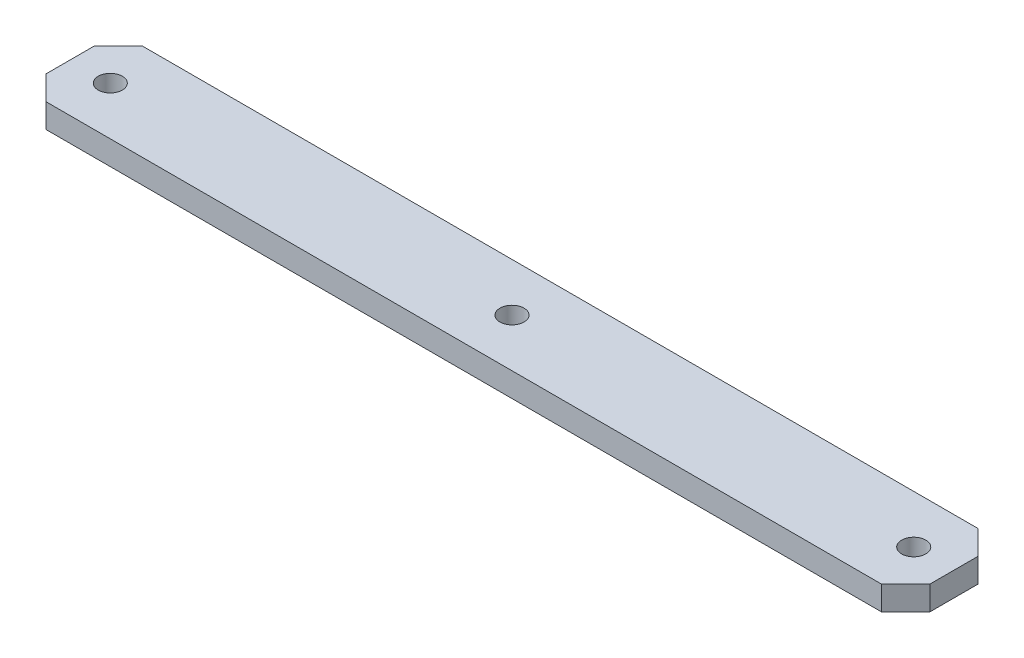
ISO-10303-21;
HEADER;
FILE_DESCRIPTION(('STEP AP214'),'2;1');
FILE_NAME('part.step','',(''),(''),'','','');
FILE_SCHEMA(('AUTOMOTIVE_DESIGN { 1 0 10303 214 1 1 1 1 }'));
ENDSEC;
DATA;
#1=APPLICATION_CONTEXT('core data for automotive mechanical design processes');
#2=APPLICATION_PROTOCOL_DEFINITION('international standard','automotive_design',2000,#1);
#3=PRODUCT_CONTEXT('',#1,'mechanical');
#4=PRODUCT('Part','Part','',(#3));
#5=PRODUCT_RELATED_PRODUCT_CATEGORY('part','',(#4));
#6=PRODUCT_DEFINITION_FORMATION('','',#4);
#7=PRODUCT_DEFINITION_CONTEXT('part definition',#1,'design');
#8=PRODUCT_DEFINITION('design','',#6,#7);
#9=PRODUCT_DEFINITION_SHAPE('','',#8);
#10=(LENGTH_UNIT() NAMED_UNIT(*) SI_UNIT(.MILLI.,.METRE.));
#11=(NAMED_UNIT(*) PLANE_ANGLE_UNIT() SI_UNIT($,.RADIAN.));
#12=(NAMED_UNIT(*) SI_UNIT($,.STERADIAN.) SOLID_ANGLE_UNIT());
#13=UNCERTAINTY_MEASURE_WITH_UNIT(LENGTH_MEASURE(1.E-05),#10,'distance_accuracy_value','');
#14=(GEOMETRIC_REPRESENTATION_CONTEXT(3) GLOBAL_UNCERTAINTY_ASSIGNED_CONTEXT((#13)) GLOBAL_UNIT_ASSIGNED_CONTEXT((#10,
#11,#12)) REPRESENTATION_CONTEXT('',''));
#15=CARTESIAN_POINT('',(0.,0.,0.));
#16=DIRECTION('',(0.,0.,1.));
#17=DIRECTION('',(1.,0.,0.));
#18=AXIS2_PLACEMENT_3D('',#15,#16,#17);
#19=CARTESIAN_POINT('',(0.,3.,0.));
#20=DIRECTION('',(0.,-1.,0.));
#21=DIRECTION('',(0.,0.,-1.));
#22=AXIS2_PLACEMENT_3D('',#19,#20,#21);
#23=PLANE('',#22);
#24=DIRECTION('',(1.,0.,0.));
#25=VECTOR('',#24,1.);
#26=CARTESIAN_POINT('',(-52.,3.,-6.));
#27=LINE('',#26,#25);
#28=CARTESIAN_POINT('',(-52.,3.,-6.));
#29=VERTEX_POINT('',#28);
#30=CARTESIAN_POINT('',(52.,3.,-6.));
#31=VERTEX_POINT('',#30);
#32=EDGE_CURVE('E237',#29,#31,#27,.T.);
#33=ORIENTED_EDGE('',*,*,#32,.F.);
#34=DIRECTION('',(0.707106781186548,0.,-0.707106781186547));
#35=VECTOR('',#34,1.);
#36=CARTESIAN_POINT('',(-55.,3.,-3.));
#37=LINE('',#36,#35);
#38=CARTESIAN_POINT('',(-55.,3.,-3.));
#39=VERTEX_POINT('',#38);
#40=EDGE_CURVE('E197',#39,#29,#37,.T.);
#41=ORIENTED_EDGE('',*,*,#40,.F.);
#42=DIRECTION('',(0.,0.,1.));
#43=VECTOR('',#42,1.);
#44=CARTESIAN_POINT('',(-55.,3.,-3.));
#45=LINE('',#44,#43);
#46=CARTESIAN_POINT('',(-55.,3.,3.));
#47=VERTEX_POINT('',#46);
#48=EDGE_CURVE('E191',#39,#47,#45,.T.);
#49=ORIENTED_EDGE('',*,*,#48,.T.);
#50=DIRECTION('',(0.707106781186548,0.,0.707106781186547));
#51=VECTOR('',#50,1.);
#52=CARTESIAN_POINT('',(-55.,3.,3.));
#53=LINE('',#52,#51);
#54=CARTESIAN_POINT('',(-52.,3.,6.));
#55=VERTEX_POINT('',#54);
#56=EDGE_CURVE('E195',#47,#55,#53,.T.);
#57=ORIENTED_EDGE('',*,*,#56,.T.);
#58=DIRECTION('',(1.,0.,0.));
#59=VECTOR('',#58,1.);
#60=CARTESIAN_POINT('',(-52.,3.,6.));
#61=LINE('',#60,#59);
#62=CARTESIAN_POINT('',(52.,3.,6.));
#63=VERTEX_POINT('',#62);
#64=EDGE_CURVE('E210',#55,#63,#61,.T.);
#65=ORIENTED_EDGE('',*,*,#64,.T.);
#66=DIRECTION('',(0.707106781186549,0.,-0.707106781186546));
#67=VECTOR('',#66,1.);
#68=CARTESIAN_POINT('',(52.,3.,6.));
#69=LINE('',#68,#67);
#70=CARTESIAN_POINT('',(55.,3.,3.));
#71=VERTEX_POINT('',#70);
#72=EDGE_CURVE('E212',#63,#71,#69,.T.);
#73=ORIENTED_EDGE('',*,*,#72,.T.);
#74=DIRECTION('',(0.,0.,1.));
#75=VECTOR('',#74,1.);
#76=CARTESIAN_POINT('',(55.,3.,-3.));
#77=LINE('',#76,#75);
#78=CARTESIAN_POINT('',(55.,3.,-3.));
#79=VERTEX_POINT('',#78);
#80=EDGE_CURVE('E305',#79,#71,#77,.T.);
#81=ORIENTED_EDGE('',*,*,#80,.F.);
#82=DIRECTION('',(0.707106781186549,0.,0.707106781186546));
#83=VECTOR('',#82,1.);
#84=CARTESIAN_POINT('',(52.,3.,-6.));
#85=LINE('',#84,#83);
#86=EDGE_CURVE('E303',#31,#79,#85,.T.);
#87=ORIENTED_EDGE('',*,*,#86,.F.);
#88=EDGE_LOOP('',(#33,#41,#49,#57,#65,#73,#81,#87));
#89=FACE_BOUND('',#88,.T.);
#90=CARTESIAN_POINT('',(-50.,3.,0.));
#91=DIRECTION('',(0.,1.,0.));
#92=DIRECTION('',(0.,0.,1.));
#93=AXIS2_PLACEMENT_3D('',#90,#91,#92);
#94=CIRCLE('',#93,1.5);
#95=CARTESIAN_POINT('',(-50.,3.,1.5));
#96=VERTEX_POINT('',#95);
#97=EDGE_CURVE('E221',#96,#96,#94,.T.);
#98=ORIENTED_EDGE('',*,*,#97,.F.);
#99=EDGE_LOOP('',(#98));
#100=FACE_BOUND('',#99,.T.);
#101=CARTESIAN_POINT('',(0.,3.,0.));
#102=DIRECTION('',(0.,1.,0.));
#103=DIRECTION('',(0.,0.,1.));
#104=AXIS2_PLACEMENT_3D('',#101,#102,#103);
#105=CIRCLE('',#104,1.5);
#106=CARTESIAN_POINT('',(0.,3.,1.5));
#107=VERTEX_POINT('',#106);
#108=EDGE_CURVE('E292',#107,#107,#105,.T.);
#109=ORIENTED_EDGE('',*,*,#108,.F.);
#110=EDGE_LOOP('',(#109));
#111=FACE_BOUND('',#110,.T.);
#112=CARTESIAN_POINT('',(50.,3.,0.));
#113=DIRECTION('',(0.,1.,0.));
#114=DIRECTION('',(0.,0.,1.));
#115=AXIS2_PLACEMENT_3D('',#112,#113,#114);
#116=CIRCLE('',#115,1.5);
#117=CARTESIAN_POINT('',(50.,3.,1.5));
#118=VERTEX_POINT('',#117);
#119=EDGE_CURVE('E283',#118,#118,#116,.T.);
#120=ORIENTED_EDGE('',*,*,#119,.F.);
#121=EDGE_LOOP('',(#120));
#122=FACE_BOUND('',#121,.T.);
#123=ADVANCED_FACE('F120',(#89,#100,#111,#122),#23,.F.);
#124=CARTESIAN_POINT('',(0.,0.,0.));
#125=DIRECTION('',(0.,-1.,0.));
#126=DIRECTION('',(0.,0.,-1.));
#127=AXIS2_PLACEMENT_3D('',#124,#125,#126);
#128=PLANE('',#127);
#129=CARTESIAN_POINT('',(0.,0.,0.));
#130=DIRECTION('',(0.,1.,0.));
#131=DIRECTION('',(0.,0.,1.));
#132=AXIS2_PLACEMENT_3D('',#129,#130,#131);
#133=CIRCLE('',#132,1.5);
#134=CARTESIAN_POINT('',(0.,0.,1.5));
#135=VERTEX_POINT('',#134);
#136=EDGE_CURVE('E289',#135,#135,#133,.T.);
#137=ORIENTED_EDGE('',*,*,#136,.T.);
#138=EDGE_LOOP('',(#137));
#139=FACE_BOUND('',#138,.T.);
#140=DIRECTION('',(1.,0.,0.));
#141=VECTOR('',#140,1.);
#142=CARTESIAN_POINT('',(-52.,0.,-6.));
#143=LINE('',#142,#141);
#144=CARTESIAN_POINT('',(-52.,0.,-6.));
#145=VERTEX_POINT('',#144);
#146=CARTESIAN_POINT('',(52.,0.,-6.));
#147=VERTEX_POINT('',#146);
#148=EDGE_CURVE('E217',#145,#147,#143,.T.);
#149=ORIENTED_EDGE('',*,*,#148,.T.);
#150=DIRECTION('',(0.707106781186549,0.,0.707106781186546));
#151=VECTOR('',#150,1.);
#152=CARTESIAN_POINT('',(52.,0.,-6.));
#153=LINE('',#152,#151);
#154=CARTESIAN_POINT('',(55.,0.,-3.));
#155=VERTEX_POINT('',#154);
#156=EDGE_CURVE('E220',#147,#155,#153,.T.);
#157=ORIENTED_EDGE('',*,*,#156,.T.);
#158=DIRECTION('',(0.,0.,1.));
#159=VECTOR('',#158,1.);
#160=CARTESIAN_POINT('',(55.,0.,-3.));
#161=LINE('',#160,#159);
#162=CARTESIAN_POINT('',(55.,0.,3.));
#163=VERTEX_POINT('',#162);
#164=EDGE_CURVE('E224',#155,#163,#161,.T.);
#165=ORIENTED_EDGE('',*,*,#164,.T.);
#166=DIRECTION('',(0.707106781186549,0.,-0.707106781186546));
#167=VECTOR('',#166,1.);
#168=CARTESIAN_POINT('',(52.,0.,6.));
#169=LINE('',#168,#167);
#170=CARTESIAN_POINT('',(52.,0.,6.));
#171=VERTEX_POINT('',#170);
#172=EDGE_CURVE('E227',#171,#163,#169,.T.);
#173=ORIENTED_EDGE('',*,*,#172,.F.);
#174=DIRECTION('',(1.,0.,0.));
#175=VECTOR('',#174,1.);
#176=CARTESIAN_POINT('',(-52.,0.,6.));
#177=LINE('',#176,#175);
#178=CARTESIAN_POINT('',(-52.,0.,6.));
#179=VERTEX_POINT('',#178);
#180=EDGE_CURVE('E230',#179,#171,#177,.T.);
#181=ORIENTED_EDGE('',*,*,#180,.F.);
#182=DIRECTION('',(0.707106781186548,0.,0.707106781186547));
#183=VECTOR('',#182,1.);
#184=CARTESIAN_POINT('',(-55.,0.,3.));
#185=LINE('',#184,#183);
#186=CARTESIAN_POINT('',(-55.,0.,3.));
#187=VERTEX_POINT('',#186);
#188=EDGE_CURVE('E232',#187,#179,#185,.T.);
#189=ORIENTED_EDGE('',*,*,#188,.F.);
#190=DIRECTION('',(0.,0.,1.));
#191=VECTOR('',#190,1.);
#192=CARTESIAN_POINT('',(-55.,0.,-3.));
#193=LINE('',#192,#191);
#194=CARTESIAN_POINT('',(-55.,0.,-3.));
#195=VERTEX_POINT('',#194);
#196=EDGE_CURVE('E202',#195,#187,#193,.T.);
#197=ORIENTED_EDGE('',*,*,#196,.F.);
#198=DIRECTION('',(0.707106781186548,0.,-0.707106781186547));
#199=VECTOR('',#198,1.);
#200=CARTESIAN_POINT('',(-55.,0.,-3.));
#201=LINE('',#200,#199);
#202=EDGE_CURVE('E235',#195,#145,#201,.T.);
#203=ORIENTED_EDGE('',*,*,#202,.T.);
#204=EDGE_LOOP('',(#149,#157,#165,#173,#181,#189,#197,#203));
#205=FACE_BOUND('',#204,.T.);
#206=CARTESIAN_POINT('',(-50.,0.,0.));
#207=DIRECTION('',(0.,1.,0.));
#208=DIRECTION('',(0.,0.,1.));
#209=AXIS2_PLACEMENT_3D('',#206,#207,#208);
#210=CIRCLE('',#209,1.5);
#211=CARTESIAN_POINT('',(-50.,0.,1.5));
#212=VERTEX_POINT('',#211);
#213=EDGE_CURVE('E295',#212,#212,#210,.T.);
#214=ORIENTED_EDGE('',*,*,#213,.T.);
#215=EDGE_LOOP('',(#214));
#216=FACE_BOUND('',#215,.T.);
#217=CARTESIAN_POINT('',(50.,0.,0.));
#218=DIRECTION('',(0.,1.,0.));
#219=DIRECTION('',(0.,0.,1.));
#220=AXIS2_PLACEMENT_3D('',#217,#218,#219);
#221=CIRCLE('',#220,1.5);
#222=CARTESIAN_POINT('',(50.,0.,1.5));
#223=VERTEX_POINT('',#222);
#224=EDGE_CURVE('E286',#223,#223,#221,.T.);
#225=ORIENTED_EDGE('',*,*,#224,.T.);
#226=EDGE_LOOP('',(#225));
#227=FACE_BOUND('',#226,.T.);
#228=ADVANCED_FACE('F249',(#139,#205,#216,#227),#128,.T.);
#229=CARTESIAN_POINT('',(-52.,3.,-6.));
#230=DIRECTION('',(0.,0.,-1.));
#231=DIRECTION('',(-1.,0.,0.));
#232=AXIS2_PLACEMENT_3D('',#229,#230,#231);
#233=PLANE('',#232);
#234=ORIENTED_EDGE('',*,*,#148,.F.);
#235=DIRECTION('',(0.,-1.,0.));
#236=VECTOR('',#235,1.);
#237=CARTESIAN_POINT('',(-52.,3.,-6.));
#238=LINE('',#237,#236);
#239=EDGE_CURVE('E12',#29,#145,#238,.T.);
#240=ORIENTED_EDGE('',*,*,#239,.F.);
#241=ORIENTED_EDGE('',*,*,#32,.T.);
#242=DIRECTION('',(0.,-1.,0.));
#243=VECTOR('',#242,1.);
#244=CARTESIAN_POINT('',(52.,3.,-6.));
#245=LINE('',#244,#243);
#246=EDGE_CURVE('E124',#31,#147,#245,.T.);
#247=ORIENTED_EDGE('',*,*,#246,.T.);
#248=EDGE_LOOP('',(#234,#240,#241,#247));
#249=FACE_BOUND('',#248,.T.);
#250=ADVANCED_FACE('F122',(#249),#233,.T.);
#251=CARTESIAN_POINT('',(-55.,3.,-3.));
#252=DIRECTION('',(-0.707106781186547,0.,-0.707106781186548));
#253=DIRECTION('',(-0.707106781186548,0.,0.707106781186547));
#254=AXIS2_PLACEMENT_3D('',#251,#252,#253);
#255=PLANE('',#254);
#256=ORIENTED_EDGE('',*,*,#202,.F.);
#257=DIRECTION('',(0.,-1.,0.));
#258=VECTOR('',#257,1.);
#259=CARTESIAN_POINT('',(-55.,3.,-3.));
#260=LINE('',#259,#258);
#261=EDGE_CURVE('E130',#39,#195,#260,.T.);
#262=ORIENTED_EDGE('',*,*,#261,.F.);
#263=ORIENTED_EDGE('',*,*,#40,.T.);
#264=ORIENTED_EDGE('',*,*,#239,.T.);
#265=EDGE_LOOP('',(#256,#262,#263,#264));
#266=FACE_BOUND('',#265,.T.);
#267=ADVANCED_FACE('F251',(#266),#255,.T.);
#268=CARTESIAN_POINT('',(-55.,3.,-3.));
#269=DIRECTION('',(1.,0.,0.));
#270=DIRECTION('',(0.,0.,-1.));
#271=AXIS2_PLACEMENT_3D('',#268,#269,#270);
#272=PLANE('',#271);
#273=ORIENTED_EDGE('',*,*,#196,.T.);
#274=DIRECTION('',(0.,-1.,0.));
#275=VECTOR('',#274,1.);
#276=CARTESIAN_POINT('',(-55.,3.,3.));
#277=LINE('',#276,#275);
#278=EDGE_CURVE('E200',#47,#187,#277,.T.);
#279=ORIENTED_EDGE('',*,*,#278,.F.);
#280=ORIENTED_EDGE('',*,*,#48,.F.);
#281=ORIENTED_EDGE('',*,*,#261,.T.);
#282=EDGE_LOOP('',(#273,#279,#280,#281));
#283=FACE_BOUND('',#282,.T.);
#284=ADVANCED_FACE('F201',(#283),#272,.F.);
#285=CARTESIAN_POINT('',(-55.,3.,3.));
#286=DIRECTION('',(0.707106781186547,0.,-0.707106781186548));
#287=DIRECTION('',(-0.707106781186548,0.,-0.707106781186547));
#288=AXIS2_PLACEMENT_3D('',#285,#286,#287);
#289=PLANE('',#288);
#290=ORIENTED_EDGE('',*,*,#188,.T.);
#291=DIRECTION('',(0.,-1.,0.));
#292=VECTOR('',#291,1.);
#293=CARTESIAN_POINT('',(-52.,3.,6.));
#294=LINE('',#293,#292);
#295=EDGE_CURVE('E205',#55,#179,#294,.T.);
#296=ORIENTED_EDGE('',*,*,#295,.F.);
#297=ORIENTED_EDGE('',*,*,#56,.F.);
#298=ORIENTED_EDGE('',*,*,#278,.T.);
#299=EDGE_LOOP('',(#290,#296,#297,#298));
#300=FACE_BOUND('',#299,.T.);
#301=ADVANCED_FACE('F207',(#300),#289,.F.);
#302=CARTESIAN_POINT('',(-52.,3.,6.));
#303=DIRECTION('',(0.,0.,-1.));
#304=DIRECTION('',(-1.,0.,0.));
#305=AXIS2_PLACEMENT_3D('',#302,#303,#304);
#306=PLANE('',#305);
#307=ORIENTED_EDGE('',*,*,#180,.T.);
#308=DIRECTION('',(0.,-1.,0.));
#309=VECTOR('',#308,1.);
#310=CARTESIAN_POINT('',(52.,3.,6.));
#311=LINE('',#310,#309);
#312=EDGE_CURVE('E241',#63,#171,#311,.T.);
#313=ORIENTED_EDGE('',*,*,#312,.F.);
#314=ORIENTED_EDGE('',*,*,#64,.F.);
#315=ORIENTED_EDGE('',*,*,#295,.T.);
#316=EDGE_LOOP('',(#307,#313,#314,#315));
#317=FACE_BOUND('',#316,.T.);
#318=ADVANCED_FACE('F318',(#317),#306,.F.);
#319=CARTESIAN_POINT('',(52.,3.,6.));
#320=DIRECTION('',(-0.707106781186546,0.,-0.707106781186549));
#321=DIRECTION('',(-0.707106781186549,0.,0.707106781186546));
#322=AXIS2_PLACEMENT_3D('',#319,#320,#321);
#323=PLANE('',#322);
#324=ORIENTED_EDGE('',*,*,#172,.T.);
#325=DIRECTION('',(0.,-1.,0.));
#326=VECTOR('',#325,1.);
#327=CARTESIAN_POINT('',(55.,3.,3.));
#328=LINE('',#327,#326);
#329=EDGE_CURVE('E244',#71,#163,#328,.T.);
#330=ORIENTED_EDGE('',*,*,#329,.F.);
#331=ORIENTED_EDGE('',*,*,#72,.F.);
#332=ORIENTED_EDGE('',*,*,#312,.T.);
#333=EDGE_LOOP('',(#324,#330,#331,#332));
#334=FACE_BOUND('',#333,.T.);
#335=ADVANCED_FACE('F312',(#334),#323,.F.);
#336=CARTESIAN_POINT('',(55.,3.,-3.));
#337=DIRECTION('',(1.,0.,0.));
#338=DIRECTION('',(0.,0.,-1.));
#339=AXIS2_PLACEMENT_3D('',#336,#337,#338);
#340=PLANE('',#339);
#341=ORIENTED_EDGE('',*,*,#164,.F.);
#342=DIRECTION('',(0.,-1.,0.));
#343=VECTOR('',#342,1.);
#344=CARTESIAN_POINT('',(55.,3.,-3.));
#345=LINE('',#344,#343);
#346=EDGE_CURVE('E245',#79,#155,#345,.T.);
#347=ORIENTED_EDGE('',*,*,#346,.F.);
#348=ORIENTED_EDGE('',*,*,#80,.T.);
#349=ORIENTED_EDGE('',*,*,#329,.T.);
#350=EDGE_LOOP('',(#341,#347,#348,#349));
#351=FACE_BOUND('',#350,.T.);
#352=ADVANCED_FACE('F315',(#351),#340,.T.);
#353=CARTESIAN_POINT('',(52.,3.,-6.));
#354=DIRECTION('',(0.707106781186546,0.,-0.707106781186549));
#355=DIRECTION('',(-0.707106781186549,0.,-0.707106781186546));
#356=AXIS2_PLACEMENT_3D('',#353,#354,#355);
#357=PLANE('',#356);
#358=ORIENTED_EDGE('',*,*,#156,.F.);
#359=ORIENTED_EDGE('',*,*,#246,.F.);
#360=ORIENTED_EDGE('',*,*,#86,.T.);
#361=ORIENTED_EDGE('',*,*,#346,.T.);
#362=EDGE_LOOP('',(#358,#359,#360,#361));
#363=FACE_BOUND('',#362,.T.);
#364=ADVANCED_FACE('F247',(#363),#357,.T.);
#365=CARTESIAN_POINT('',(-50.,3.,0.));
#366=DIRECTION('',(0.,-1.,0.));
#367=DIRECTION('',(0.,0.,-1.));
#368=AXIS2_PLACEMENT_3D('',#365,#366,#367);
#369=CYLINDRICAL_SURFACE('',#368,1.5);
#370=ORIENTED_EDGE('',*,*,#97,.T.);
#371=EDGE_LOOP('',(#370));
#372=FACE_BOUND('',#371,.T.);
#373=ORIENTED_EDGE('',*,*,#213,.F.);
#374=EDGE_LOOP('',(#373));
#375=FACE_BOUND('',#374,.T.);
#376=ADVANCED_FACE('F267',(#372,#375),#369,.F.);
#377=CARTESIAN_POINT('',(0.,3.,0.));
#378=DIRECTION('',(0.,-1.,0.));
#379=DIRECTION('',(0.,0.,-1.));
#380=AXIS2_PLACEMENT_3D('',#377,#378,#379);
#381=CYLINDRICAL_SURFACE('',#380,1.5);
#382=ORIENTED_EDGE('',*,*,#108,.T.);
#383=EDGE_LOOP('',(#382));
#384=FACE_BOUND('',#383,.T.);
#385=ORIENTED_EDGE('',*,*,#136,.F.);
#386=EDGE_LOOP('',(#385));
#387=FACE_BOUND('',#386,.T.);
#388=ADVANCED_FACE('F270',(#384,#387),#381,.F.);
#389=CARTESIAN_POINT('',(50.,3.,0.));
#390=DIRECTION('',(0.,-1.,0.));
#391=DIRECTION('',(0.,0.,-1.));
#392=AXIS2_PLACEMENT_3D('',#389,#390,#391);
#393=CYLINDRICAL_SURFACE('',#392,1.5);
#394=ORIENTED_EDGE('',*,*,#119,.T.);
#395=EDGE_LOOP('',(#394));
#396=FACE_BOUND('',#395,.T.);
#397=ORIENTED_EDGE('',*,*,#224,.F.);
#398=EDGE_LOOP('',(#397));
#399=FACE_BOUND('',#398,.T.);
#400=ADVANCED_FACE('F274',(#396,#399),#393,.F.);
#401=CLOSED_SHELL('',(#123,#228,#250,#267,#284,#301,#318,#335,#352,#364,#376,#388,#400));
#402=MANIFOLD_SOLID_BREP('B2',#401);
#403=ADVANCED_BREP_SHAPE_REPRESENTATION('',(#18,#402),#14);
#404=SHAPE_DEFINITION_REPRESENTATION(#9,#403);
ENDSEC;
END-ISO-10303-21;
